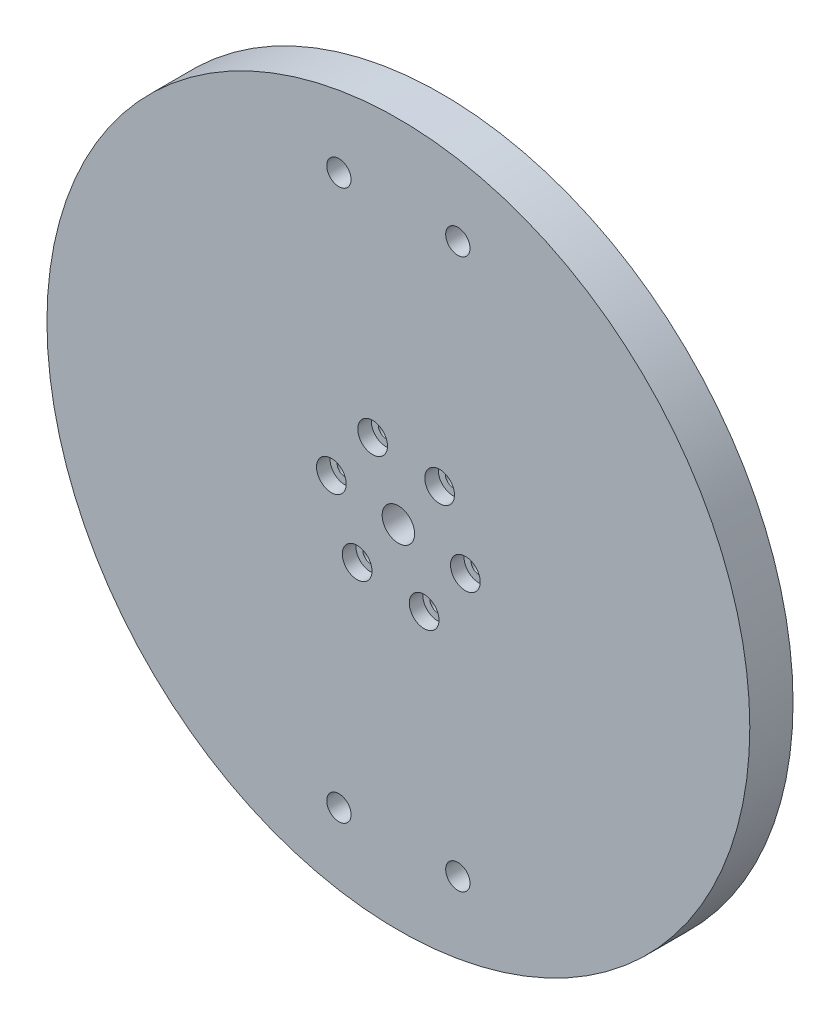
ISO-10303-21;
HEADER;
FILE_DESCRIPTION(('STEP AP214'),'2;1');
FILE_NAME('part.step','',(''),(''),'','','');
FILE_SCHEMA(('AUTOMOTIVE_DESIGN { 1 0 10303 214 1 1 1 1 }'));
ENDSEC;
DATA;
#1=APPLICATION_CONTEXT('core data for automotive mechanical design processes');
#2=APPLICATION_PROTOCOL_DEFINITION('international standard','automotive_design',2000,#1);
#3=PRODUCT_CONTEXT('',#1,'mechanical');
#4=PRODUCT('Part','Part','',(#3));
#5=PRODUCT_RELATED_PRODUCT_CATEGORY('part','',(#4));
#6=PRODUCT_DEFINITION_FORMATION('','',#4);
#7=PRODUCT_DEFINITION_CONTEXT('part definition',#1,'design');
#8=PRODUCT_DEFINITION('design','',#6,#7);
#9=PRODUCT_DEFINITION_SHAPE('','',#8);
#10=(LENGTH_UNIT() NAMED_UNIT(*) SI_UNIT(.MILLI.,.METRE.));
#11=(NAMED_UNIT(*) PLANE_ANGLE_UNIT() SI_UNIT($,.RADIAN.));
#12=(NAMED_UNIT(*) SI_UNIT($,.STERADIAN.) SOLID_ANGLE_UNIT());
#13=UNCERTAINTY_MEASURE_WITH_UNIT(LENGTH_MEASURE(1.E-05),#10,'distance_accuracy_value','');
#14=(GEOMETRIC_REPRESENTATION_CONTEXT(3) GLOBAL_UNCERTAINTY_ASSIGNED_CONTEXT((#13)) GLOBAL_UNIT_ASSIGNED_CONTEXT((#10,
#11,#12)) REPRESENTATION_CONTEXT('',''));
#15=CARTESIAN_POINT('',(0.,0.,0.));
#16=DIRECTION('',(0.,0.,1.));
#17=DIRECTION('',(1.,0.,0.));
#18=AXIS2_PLACEMENT_3D('',#15,#16,#17);
#19=CARTESIAN_POINT('',(7.62681454876585,9.90362054193988,78.));
#20=DIRECTION('',(0.,0.,-1.));
#21=DIRECTION('',(-1.,0.,0.));
#22=AXIS2_PLACEMENT_3D('',#19,#20,#21);
#23=CYLINDRICAL_SURFACE('',#22,1.45);
#24=CARTESIAN_POINT('',(7.62681454876585,9.90362054193988,70.));
#25=DIRECTION('',(0.,0.,1.));
#26=DIRECTION('',(1.,0.,0.));
#27=AXIS2_PLACEMENT_3D('',#24,#25,#26);
#28=CIRCLE('',#27,1.45);
#29=CARTESIAN_POINT('',(9.07681454876585,9.90362054193988,70.));
#30=VERTEX_POINT('',#29);
#31=EDGE_CURVE('E120',#30,#30,#28,.T.);
#32=ORIENTED_EDGE('',*,*,#31,.F.);
#33=EDGE_LOOP('',(#32));
#34=FACE_BOUND('',#33,.T.);
#35=CARTESIAN_POINT('',(7.62681454876585,9.90362054193988,75.5));
#36=DIRECTION('',(0.,0.,1.));
#37=DIRECTION('',(1.,0.,0.));
#38=AXIS2_PLACEMENT_3D('',#35,#36,#37);
#39=CIRCLE('',#38,1.45);
#40=CARTESIAN_POINT('',(9.07681454876585,9.90362054193988,75.5));
#41=VERTEX_POINT('',#40);
#42=EDGE_CURVE('E44',#41,#41,#39,.T.);
#43=ORIENTED_EDGE('',*,*,#42,.T.);
#44=EDGE_LOOP('',(#43));
#45=FACE_BOUND('',#44,.T.);
#46=ADVANCED_FACE('F41',(#34,#45),#23,.F.);
#47=CARTESIAN_POINT('',(-4.76337970437843,11.5568254201539,78.));
#48=DIRECTION('',(0.,0.,-1.));
#49=DIRECTION('',(-1.,0.,0.));
#50=AXIS2_PLACEMENT_3D('',#47,#48,#49);
#51=CYLINDRICAL_SURFACE('',#50,1.45);
#52=CARTESIAN_POINT('',(-4.76337970437843,11.5568254201539,70.));
#53=DIRECTION('',(0.,0.,1.));
#54=DIRECTION('',(1.,0.,0.));
#55=AXIS2_PLACEMENT_3D('',#52,#53,#54);
#56=CIRCLE('',#55,1.45);
#57=CARTESIAN_POINT('',(-3.31337970437843,11.5568254201539,70.));
#58=VERTEX_POINT('',#57);
#59=EDGE_CURVE('E121',#58,#58,#56,.T.);
#60=ORIENTED_EDGE('',*,*,#59,.F.);
#61=EDGE_LOOP('',(#60));
#62=FACE_BOUND('',#61,.T.);
#63=CARTESIAN_POINT('',(-4.76337970437843,11.5568254201539,75.5));
#64=DIRECTION('',(0.,0.,1.));
#65=DIRECTION('',(1.,0.,0.));
#66=AXIS2_PLACEMENT_3D('',#63,#64,#65);
#67=CIRCLE('',#66,1.45);
#68=CARTESIAN_POINT('',(-3.31337970437843,11.5568254201539,75.5));
#69=VERTEX_POINT('',#68);
#70=EDGE_CURVE('E96',#69,#69,#67,.T.);
#71=ORIENTED_EDGE('',*,*,#70,.T.);
#72=EDGE_LOOP('',(#71));
#73=FACE_BOUND('',#72,.T.);
#74=ADVANCED_FACE('F139',(#62,#73),#51,.F.);
#75=CARTESIAN_POINT('',(-12.3901942531443,1.65320487821403,78.));
#76=DIRECTION('',(0.,0.,-1.));
#77=DIRECTION('',(-1.,0.,0.));
#78=AXIS2_PLACEMENT_3D('',#75,#76,#77);
#79=CYLINDRICAL_SURFACE('',#78,1.45);
#80=CARTESIAN_POINT('',(-12.3901942531443,1.65320487821403,70.));
#81=DIRECTION('',(0.,0.,1.));
#82=DIRECTION('',(1.,0.,0.));
#83=AXIS2_PLACEMENT_3D('',#80,#81,#82);
#84=CIRCLE('',#83,1.45);
#85=CARTESIAN_POINT('',(-10.9401942531443,1.65320487821403,70.));
#86=VERTEX_POINT('',#85);
#87=EDGE_CURVE('E116',#86,#86,#84,.T.);
#88=ORIENTED_EDGE('',*,*,#87,.F.);
#89=EDGE_LOOP('',(#88));
#90=FACE_BOUND('',#89,.T.);
#91=CARTESIAN_POINT('',(-12.3901942531443,1.65320487821403,75.5));
#92=DIRECTION('',(0.,0.,1.));
#93=DIRECTION('',(1.,0.,0.));
#94=AXIS2_PLACEMENT_3D('',#91,#92,#93);
#95=CIRCLE('',#94,1.45);
#96=CARTESIAN_POINT('',(-10.9401942531443,1.65320487821403,75.5));
#97=VERTEX_POINT('',#96);
#98=EDGE_CURVE('E91',#97,#97,#95,.T.);
#99=ORIENTED_EDGE('',*,*,#98,.T.);
#100=EDGE_LOOP('',(#99));
#101=FACE_BOUND('',#100,.T.);
#102=ADVANCED_FACE('F133',(#90,#101),#79,.F.);
#103=CARTESIAN_POINT('',(-7.62681454876585,-9.90362054193988,78.));
#104=DIRECTION('',(0.,0.,-1.));
#105=DIRECTION('',(-1.,0.,0.));
#106=AXIS2_PLACEMENT_3D('',#103,#104,#105);
#107=CYLINDRICAL_SURFACE('',#106,1.45);
#108=CARTESIAN_POINT('',(-7.62681454876585,-9.90362054193988,70.));
#109=DIRECTION('',(0.,0.,1.));
#110=DIRECTION('',(1.,0.,0.));
#111=AXIS2_PLACEMENT_3D('',#108,#109,#110);
#112=CIRCLE('',#111,1.45);
#113=CARTESIAN_POINT('',(-6.17681454876585,-9.90362054193988,70.));
#114=VERTEX_POINT('',#113);
#115=EDGE_CURVE('E62',#114,#114,#112,.T.);
#116=ORIENTED_EDGE('',*,*,#115,.F.);
#117=EDGE_LOOP('',(#116));
#118=FACE_BOUND('',#117,.T.);
#119=CARTESIAN_POINT('',(-7.62681454876585,-9.90362054193988,75.5));
#120=DIRECTION('',(0.,0.,1.));
#121=DIRECTION('',(1.,0.,0.));
#122=AXIS2_PLACEMENT_3D('',#119,#120,#121);
#123=CIRCLE('',#122,1.45);
#124=CARTESIAN_POINT('',(-6.17681454876585,-9.90362054193988,75.5));
#125=VERTEX_POINT('',#124);
#126=EDGE_CURVE('E90',#125,#125,#123,.T.);
#127=ORIENTED_EDGE('',*,*,#126,.T.);
#128=EDGE_LOOP('',(#127));
#129=FACE_BOUND('',#128,.T.);
#130=ADVANCED_FACE('F140',(#118,#129),#107,.F.);
#131=CARTESIAN_POINT('',(4.76337970437842,-11.5568254201539,78.));
#132=DIRECTION('',(0.,0.,-1.));
#133=DIRECTION('',(-1.,0.,0.));
#134=AXIS2_PLACEMENT_3D('',#131,#132,#133);
#135=CYLINDRICAL_SURFACE('',#134,1.45);
#136=CARTESIAN_POINT('',(4.76337970437842,-11.5568254201539,70.));
#137=DIRECTION('',(0.,0.,1.));
#138=DIRECTION('',(1.,0.,0.));
#139=AXIS2_PLACEMENT_3D('',#136,#137,#138);
#140=CIRCLE('',#139,1.45);
#141=CARTESIAN_POINT('',(6.21337970437842,-11.5568254201539,70.));
#142=VERTEX_POINT('',#141);
#143=EDGE_CURVE('E104',#142,#142,#140,.T.);
#144=ORIENTED_EDGE('',*,*,#143,.F.);
#145=EDGE_LOOP('',(#144));
#146=FACE_BOUND('',#145,.T.);
#147=CARTESIAN_POINT('',(4.76337970437842,-11.5568254201539,75.5));
#148=DIRECTION('',(0.,0.,1.));
#149=DIRECTION('',(1.,0.,0.));
#150=AXIS2_PLACEMENT_3D('',#147,#148,#149);
#151=CIRCLE('',#150,1.45);
#152=CARTESIAN_POINT('',(6.21337970437842,-11.5568254201539,75.5));
#153=VERTEX_POINT('',#152);
#154=EDGE_CURVE('E81',#153,#153,#151,.T.);
#155=ORIENTED_EDGE('',*,*,#154,.T.);
#156=EDGE_LOOP('',(#155));
#157=FACE_BOUND('',#156,.T.);
#158=ADVANCED_FACE('F219',(#146,#157),#135,.F.);
#159=CARTESIAN_POINT('',(12.3901942531443,-1.65320487821403,78.));
#160=DIRECTION('',(0.,0.,-1.));
#161=DIRECTION('',(-1.,0.,0.));
#162=AXIS2_PLACEMENT_3D('',#159,#160,#161);
#163=CYLINDRICAL_SURFACE('',#162,1.45);
#164=CARTESIAN_POINT('',(12.3901942531443,-1.65320487821403,70.));
#165=DIRECTION('',(0.,0.,1.));
#166=DIRECTION('',(1.,0.,0.));
#167=AXIS2_PLACEMENT_3D('',#164,#165,#166);
#168=CIRCLE('',#167,1.45);
#169=CARTESIAN_POINT('',(13.8401942531443,-1.65320487821403,70.));
#170=VERTEX_POINT('',#169);
#171=EDGE_CURVE('E66',#170,#170,#168,.T.);
#172=ORIENTED_EDGE('',*,*,#171,.F.);
#173=EDGE_LOOP('',(#172));
#174=FACE_BOUND('',#173,.T.);
#175=CARTESIAN_POINT('',(12.3901942531443,-1.65320487821403,75.5));
#176=DIRECTION('',(0.,0.,1.));
#177=DIRECTION('',(1.,0.,0.));
#178=AXIS2_PLACEMENT_3D('',#175,#176,#177);
#179=CIRCLE('',#178,1.45);
#180=CARTESIAN_POINT('',(13.8401942531443,-1.65320487821403,75.5));
#181=VERTEX_POINT('',#180);
#182=EDGE_CURVE('E80',#181,#181,#179,.T.);
#183=ORIENTED_EDGE('',*,*,#182,.T.);
#184=EDGE_LOOP('',(#183));
#185=FACE_BOUND('',#184,.T.);
#186=ADVANCED_FACE('F285',(#174,#185),#163,.F.);
#187=CARTESIAN_POINT('',(0.,0.,78.));
#188=DIRECTION('',(0.,0.,-1.));
#189=DIRECTION('',(-1.,0.,0.));
#190=AXIS2_PLACEMENT_3D('',#187,#188,#189);
#191=CYLINDRICAL_SURFACE('',#190,65.);
#192=CARTESIAN_POINT('',(0.,0.,78.));
#193=DIRECTION('',(0.,0.,1.));
#194=DIRECTION('',(1.,0.,0.));
#195=AXIS2_PLACEMENT_3D('',#192,#193,#194);
#196=CIRCLE('',#195,65.);
#197=CARTESIAN_POINT('',(65.,0.,78.));
#198=VERTEX_POINT('',#197);
#199=EDGE_CURVE('E49',#198,#198,#196,.T.);
#200=ORIENTED_EDGE('',*,*,#199,.F.);
#201=EDGE_LOOP('',(#200));
#202=FACE_BOUND('',#201,.T.);
#203=CARTESIAN_POINT('',(0.,0.,70.));
#204=DIRECTION('',(0.,0.,1.));
#205=DIRECTION('',(1.,0.,0.));
#206=AXIS2_PLACEMENT_3D('',#203,#204,#205);
#207=CIRCLE('',#206,65.);
#208=CARTESIAN_POINT('',(65.,0.,70.));
#209=VERTEX_POINT('',#208);
#210=EDGE_CURVE('E59',#209,#209,#207,.T.);
#211=ORIENTED_EDGE('',*,*,#210,.T.);
#212=EDGE_LOOP('',(#211));
#213=FACE_BOUND('',#212,.T.);
#214=ADVANCED_FACE('F43',(#202,#213),#191,.T.);
#215=CARTESIAN_POINT('',(0.,0.,78.));
#216=DIRECTION('',(0.,0.,1.));
#217=DIRECTION('',(1.,0.,0.));
#218=AXIS2_PLACEMENT_3D('',#215,#216,#217);
#219=PLANE('',#218);
#220=CARTESIAN_POINT('',(-11.,50.86,78.));
#221=DIRECTION('',(0.,0.,1.));
#222=DIRECTION('',(1.,0.,0.));
#223=AXIS2_PLACEMENT_3D('',#220,#221,#222);
#224=CIRCLE('',#223,2.25);
#225=CARTESIAN_POINT('',(-8.75,50.86,78.));
#226=VERTEX_POINT('',#225);
#227=EDGE_CURVE('E309',#226,#226,#224,.T.);
#228=ORIENTED_EDGE('',*,*,#227,.F.);
#229=EDGE_LOOP('',(#228));
#230=FACE_BOUND('',#229,.T.);
#231=CARTESIAN_POINT('',(11.,-50.86,78.));
#232=DIRECTION('',(0.,0.,1.));
#233=DIRECTION('',(1.,0.,0.));
#234=AXIS2_PLACEMENT_3D('',#231,#232,#233);
#235=CIRCLE('',#234,2.25);
#236=CARTESIAN_POINT('',(13.25,-50.86,78.));
#237=VERTEX_POINT('',#236);
#238=EDGE_CURVE('E301',#237,#237,#235,.T.);
#239=ORIENTED_EDGE('',*,*,#238,.F.);
#240=EDGE_LOOP('',(#239));
#241=FACE_BOUND('',#240,.T.);
#242=CARTESIAN_POINT('',(11.,50.86,78.));
#243=DIRECTION('',(0.,0.,1.));
#244=DIRECTION('',(1.,0.,0.));
#245=AXIS2_PLACEMENT_3D('',#242,#243,#244);
#246=CIRCLE('',#245,2.25);
#247=CARTESIAN_POINT('',(13.25,50.86,78.));
#248=VERTEX_POINT('',#247);
#249=EDGE_CURVE('E297',#248,#248,#246,.T.);
#250=ORIENTED_EDGE('',*,*,#249,.F.);
#251=EDGE_LOOP('',(#250));
#252=FACE_BOUND('',#251,.T.);
#253=CARTESIAN_POINT('',(-11.,-50.86,78.));
#254=DIRECTION('',(0.,0.,1.));
#255=DIRECTION('',(1.,0.,0.));
#256=AXIS2_PLACEMENT_3D('',#253,#254,#255);
#257=CIRCLE('',#256,2.25);
#258=CARTESIAN_POINT('',(-8.75,-50.86,78.));
#259=VERTEX_POINT('',#258);
#260=EDGE_CURVE('E318',#259,#259,#257,.T.);
#261=ORIENTED_EDGE('',*,*,#260,.F.);
#262=EDGE_LOOP('',(#261));
#263=FACE_BOUND('',#262,.T.);
#264=CARTESIAN_POINT('',(0.,0.,78.));
#265=DIRECTION('',(0.,0.,1.));
#266=DIRECTION('',(1.,0.,0.));
#267=AXIS2_PLACEMENT_3D('',#264,#265,#266);
#268=CIRCLE('',#267,3.);
#269=CARTESIAN_POINT('',(3.,0.,78.));
#270=VERTEX_POINT('',#269);
#271=EDGE_CURVE('E324',#270,#270,#268,.T.);
#272=ORIENTED_EDGE('',*,*,#271,.F.);
#273=EDGE_LOOP('',(#272));
#274=FACE_BOUND('',#273,.T.);
#275=CARTESIAN_POINT('',(7.62681454876585,9.90362054193988,78.));
#276=DIRECTION('',(0.,0.,1.));
#277=DIRECTION('',(1.,0.,0.));
#278=AXIS2_PLACEMENT_3D('',#275,#276,#277);
#279=CIRCLE('',#278,2.75);
#280=CARTESIAN_POINT('',(10.3768145487658,9.90362054193988,78.));
#281=VERTEX_POINT('',#280);
#282=EDGE_CURVE('E183',#281,#281,#279,.T.);
#283=ORIENTED_EDGE('',*,*,#282,.F.);
#284=EDGE_LOOP('',(#283));
#285=FACE_BOUND('',#284,.T.);
#286=CARTESIAN_POINT('',(-4.76337970437843,11.5568254201539,78.));
#287=DIRECTION('',(0.,0.,1.));
#288=DIRECTION('',(1.,0.,0.));
#289=AXIS2_PLACEMENT_3D('',#286,#287,#288);
#290=CIRCLE('',#289,2.75);
#291=CARTESIAN_POINT('',(-2.01337970437843,11.5568254201539,78.));
#292=VERTEX_POINT('',#291);
#293=EDGE_CURVE('E153',#292,#292,#290,.T.);
#294=ORIENTED_EDGE('',*,*,#293,.F.);
#295=EDGE_LOOP('',(#294));
#296=FACE_BOUND('',#295,.T.);
#297=CARTESIAN_POINT('',(-12.3901942531443,1.65320487821403,78.));
#298=DIRECTION('',(0.,0.,1.));
#299=DIRECTION('',(1.,0.,0.));
#300=AXIS2_PLACEMENT_3D('',#297,#298,#299);
#301=CIRCLE('',#300,2.75);
#302=CARTESIAN_POINT('',(-9.64019425314427,1.65320487821403,78.));
#303=VERTEX_POINT('',#302);
#304=EDGE_CURVE('E152',#303,#303,#301,.T.);
#305=ORIENTED_EDGE('',*,*,#304,.F.);
#306=EDGE_LOOP('',(#305));
#307=FACE_BOUND('',#306,.T.);
#308=CARTESIAN_POINT('',(-7.62681454876585,-9.90362054193988,78.));
#309=DIRECTION('',(0.,0.,1.));
#310=DIRECTION('',(1.,0.,0.));
#311=AXIS2_PLACEMENT_3D('',#308,#309,#310);
#312=CIRCLE('',#311,2.75);
#313=CARTESIAN_POINT('',(-4.87681454876585,-9.90362054193988,78.));
#314=VERTEX_POINT('',#313);
#315=EDGE_CURVE('E166',#314,#314,#312,.T.);
#316=ORIENTED_EDGE('',*,*,#315,.F.);
#317=EDGE_LOOP('',(#316));
#318=FACE_BOUND('',#317,.T.);
#319=CARTESIAN_POINT('',(4.76337970437842,-11.5568254201539,78.));
#320=DIRECTION('',(0.,0.,1.));
#321=DIRECTION('',(1.,0.,0.));
#322=AXIS2_PLACEMENT_3D('',#319,#320,#321);
#323=CIRCLE('',#322,2.75);
#324=CARTESIAN_POINT('',(7.51337970437842,-11.5568254201539,78.));
#325=VERTEX_POINT('',#324);
#326=EDGE_CURVE('E191',#325,#325,#323,.T.);
#327=ORIENTED_EDGE('',*,*,#326,.F.);
#328=EDGE_LOOP('',(#327));
#329=FACE_BOUND('',#328,.T.);
#330=CARTESIAN_POINT('',(12.3901942531443,-1.65320487821403,78.));
#331=DIRECTION('',(0.,0.,1.));
#332=DIRECTION('',(1.,0.,0.));
#333=AXIS2_PLACEMENT_3D('',#330,#331,#332);
#334=CIRCLE('',#333,2.75);
#335=CARTESIAN_POINT('',(15.1401942531443,-1.65320487821403,78.));
#336=VERTEX_POINT('',#335);
#337=EDGE_CURVE('E83',#336,#336,#334,.T.);
#338=ORIENTED_EDGE('',*,*,#337,.F.);
#339=EDGE_LOOP('',(#338));
#340=FACE_BOUND('',#339,.T.);
#341=ORIENTED_EDGE('',*,*,#199,.T.);
#342=EDGE_LOOP('',(#341));
#343=FACE_BOUND('',#342,.T.);
#344=ADVANCED_FACE('F236',(#230,#241,#252,#263,#274,#285,#296,#307,#318,#329,#340,#343),#219,.T.);
#345=CARTESIAN_POINT('',(0.,0.,70.));
#346=DIRECTION('',(0.,0.,1.));
#347=DIRECTION('',(1.,0.,0.));
#348=AXIS2_PLACEMENT_3D('',#345,#346,#347);
#349=PLANE('',#348);
#350=CARTESIAN_POINT('',(-11.,50.86,70.));
#351=DIRECTION('',(0.,0.,1.));
#352=DIRECTION('',(1.,0.,0.));
#353=AXIS2_PLACEMENT_3D('',#350,#351,#352);
#354=CIRCLE('',#353,2.25);
#355=CARTESIAN_POINT('',(-8.75,50.86,70.));
#356=VERTEX_POINT('',#355);
#357=EDGE_CURVE('E307',#356,#356,#354,.T.);
#358=ORIENTED_EDGE('',*,*,#357,.T.);
#359=EDGE_LOOP('',(#358));
#360=FACE_BOUND('',#359,.T.);
#361=CARTESIAN_POINT('',(11.,-50.86,70.));
#362=DIRECTION('',(0.,0.,1.));
#363=DIRECTION('',(1.,0.,0.));
#364=AXIS2_PLACEMENT_3D('',#361,#362,#363);
#365=CIRCLE('',#364,2.25);
#366=CARTESIAN_POINT('',(13.25,-50.86,70.));
#367=VERTEX_POINT('',#366);
#368=EDGE_CURVE('E296',#367,#367,#365,.T.);
#369=ORIENTED_EDGE('',*,*,#368,.T.);
#370=EDGE_LOOP('',(#369));
#371=FACE_BOUND('',#370,.T.);
#372=CARTESIAN_POINT('',(11.,50.86,70.));
#373=DIRECTION('',(0.,0.,1.));
#374=DIRECTION('',(1.,0.,0.));
#375=AXIS2_PLACEMENT_3D('',#372,#373,#374);
#376=CIRCLE('',#375,2.25);
#377=CARTESIAN_POINT('',(13.25,50.86,70.));
#378=VERTEX_POINT('',#377);
#379=EDGE_CURVE('E298',#378,#378,#376,.T.);
#380=ORIENTED_EDGE('',*,*,#379,.T.);
#381=EDGE_LOOP('',(#380));
#382=FACE_BOUND('',#381,.T.);
#383=CARTESIAN_POINT('',(-11.,-50.86,70.));
#384=DIRECTION('',(0.,0.,1.));
#385=DIRECTION('',(1.,0.,0.));
#386=AXIS2_PLACEMENT_3D('',#383,#384,#385);
#387=CIRCLE('',#386,2.25);
#388=CARTESIAN_POINT('',(-8.75,-50.86,70.));
#389=VERTEX_POINT('',#388);
#390=EDGE_CURVE('E310',#389,#389,#387,.T.);
#391=ORIENTED_EDGE('',*,*,#390,.T.);
#392=EDGE_LOOP('',(#391));
#393=FACE_BOUND('',#392,.T.);
#394=CARTESIAN_POINT('',(0.,0.,70.));
#395=DIRECTION('',(0.,0.,1.));
#396=DIRECTION('',(1.,0.,0.));
#397=AXIS2_PLACEMENT_3D('',#394,#395,#396);
#398=CIRCLE('',#397,24.9);
#399=CARTESIAN_POINT('',(24.9,0.,70.));
#400=VERTEX_POINT('',#399);
#401=EDGE_CURVE('E68',#400,#400,#398,.T.);
#402=ORIENTED_EDGE('',*,*,#401,.T.);
#403=EDGE_LOOP('',(#402));
#404=FACE_BOUND('',#403,.T.);
#405=ORIENTED_EDGE('',*,*,#210,.F.);
#406=EDGE_LOOP('',(#405));
#407=FACE_BOUND('',#406,.T.);
#408=ADVANCED_FACE('F234',(#360,#371,#382,#393,#404,#407),#349,.F.);
#409=CARTESIAN_POINT('',(0.,0.,67.));
#410=DIRECTION('',(0.,0.,1.));
#411=DIRECTION('',(1.,0.,0.));
#412=AXIS2_PLACEMENT_3D('',#409,#410,#411);
#413=PLANE('',#412);
#414=CARTESIAN_POINT('',(0.,0.,67.));
#415=DIRECTION('',(0.,0.,1.));
#416=DIRECTION('',(1.,0.,0.));
#417=AXIS2_PLACEMENT_3D('',#414,#415,#416);
#418=CIRCLE('',#417,24.9);
#419=CARTESIAN_POINT('',(24.9,0.,67.));
#420=VERTEX_POINT('',#419);
#421=EDGE_CURVE('E69',#420,#420,#418,.T.);
#422=ORIENTED_EDGE('',*,*,#421,.F.);
#423=EDGE_LOOP('',(#422));
#424=FACE_BOUND('',#423,.T.);
#425=CARTESIAN_POINT('',(0.,0.,67.));
#426=DIRECTION('',(0.,0.,1.));
#427=DIRECTION('',(1.,0.,0.));
#428=AXIS2_PLACEMENT_3D('',#425,#426,#427);
#429=CIRCLE('',#428,23.);
#430=CARTESIAN_POINT('',(23.,0.,67.));
#431=VERTEX_POINT('',#430);
#432=EDGE_CURVE('E63',#431,#431,#429,.T.);
#433=ORIENTED_EDGE('',*,*,#432,.T.);
#434=EDGE_LOOP('',(#433));
#435=FACE_BOUND('',#434,.T.);
#436=ADVANCED_FACE('F230',(#424,#435),#413,.F.);
#437=CARTESIAN_POINT('',(0.,0.,70.));
#438=DIRECTION('',(0.,0.,-1.));
#439=DIRECTION('',(-1.,0.,0.));
#440=AXIS2_PLACEMENT_3D('',#437,#438,#439);
#441=CYLINDRICAL_SURFACE('',#440,24.9);
#442=ORIENTED_EDGE('',*,*,#401,.F.);
#443=EDGE_LOOP('',(#442));
#444=FACE_BOUND('',#443,.T.);
#445=ORIENTED_EDGE('',*,*,#421,.T.);
#446=EDGE_LOOP('',(#445));
#447=FACE_BOUND('',#446,.T.);
#448=ADVANCED_FACE('F228',(#444,#447),#441,.T.);
#449=CARTESIAN_POINT('',(0.,0.,70.));
#450=DIRECTION('',(0.,0.,-1.));
#451=DIRECTION('',(-1.,0.,0.));
#452=AXIS2_PLACEMENT_3D('',#449,#450,#451);
#453=CYLINDRICAL_SURFACE('',#452,23.);
#454=CARTESIAN_POINT('',(0.,0.,70.));
#455=DIRECTION('',(0.,0.,1.));
#456=DIRECTION('',(1.,0.,0.));
#457=AXIS2_PLACEMENT_3D('',#454,#455,#456);
#458=CIRCLE('',#457,23.);
#459=CARTESIAN_POINT('',(23.,0.,70.));
#460=VERTEX_POINT('',#459);
#461=EDGE_CURVE('E10',#460,#460,#458,.T.);
#462=ORIENTED_EDGE('',*,*,#461,.T.);
#463=EDGE_LOOP('',(#462));
#464=FACE_BOUND('',#463,.T.);
#465=ORIENTED_EDGE('',*,*,#432,.F.);
#466=EDGE_LOOP('',(#465));
#467=FACE_BOUND('',#466,.T.);
#468=ADVANCED_FACE('F226',(#464,#467),#453,.F.);
#469=CARTESIAN_POINT('',(0.,0.,70.));
#470=DIRECTION('',(0.,0.,1.));
#471=DIRECTION('',(1.,0.,0.));
#472=AXIS2_PLACEMENT_3D('',#469,#470,#471);
#473=CIRCLE('',#472,3.);
#474=CARTESIAN_POINT('',(3.,0.,70.));
#475=VERTEX_POINT('',#474);
#476=EDGE_CURVE('E260',#475,#475,#473,.T.);
#477=ORIENTED_EDGE('',*,*,#476,.T.);
#478=EDGE_LOOP('',(#477));
#479=FACE_BOUND('',#478,.T.);
#480=ORIENTED_EDGE('',*,*,#171,.T.);
#481=EDGE_LOOP('',(#480));
#482=FACE_BOUND('',#481,.T.);
#483=ORIENTED_EDGE('',*,*,#143,.T.);
#484=EDGE_LOOP('',(#483));
#485=FACE_BOUND('',#484,.T.);
#486=ORIENTED_EDGE('',*,*,#115,.T.);
#487=EDGE_LOOP('',(#486));
#488=FACE_BOUND('',#487,.T.);
#489=ORIENTED_EDGE('',*,*,#87,.T.);
#490=EDGE_LOOP('',(#489));
#491=FACE_BOUND('',#490,.T.);
#492=ORIENTED_EDGE('',*,*,#59,.T.);
#493=EDGE_LOOP('',(#492));
#494=FACE_BOUND('',#493,.T.);
#495=ORIENTED_EDGE('',*,*,#31,.T.);
#496=EDGE_LOOP('',(#495));
#497=FACE_BOUND('',#496,.T.);
#498=ORIENTED_EDGE('',*,*,#461,.F.);
#499=EDGE_LOOP('',(#498));
#500=FACE_BOUND('',#499,.T.);
#501=ADVANCED_FACE('F131',(#479,#482,#485,#488,#491,#494,#497,#500),#349,.F.);
#502=CARTESIAN_POINT('',(12.3901942531443,-1.65320487821403,78.));
#503=DIRECTION('',(0.,0.,-1.));
#504=DIRECTION('',(-1.,0.,0.));
#505=AXIS2_PLACEMENT_3D('',#502,#503,#504);
#506=CYLINDRICAL_SURFACE('',#505,2.75);
#507=ORIENTED_EDGE('',*,*,#337,.T.);
#508=EDGE_LOOP('',(#507));
#509=FACE_BOUND('',#508,.T.);
#510=CARTESIAN_POINT('',(12.3901942531443,-1.65320487821403,75.5));
#511=DIRECTION('',(0.,0.,1.));
#512=DIRECTION('',(1.,0.,0.));
#513=AXIS2_PLACEMENT_3D('',#510,#511,#512);
#514=CIRCLE('',#513,2.75);
#515=CARTESIAN_POINT('',(15.1401942531443,-1.65320487821403,75.5));
#516=VERTEX_POINT('',#515);
#517=EDGE_CURVE('E175',#516,#516,#514,.T.);
#518=ORIENTED_EDGE('',*,*,#517,.F.);
#519=EDGE_LOOP('',(#518));
#520=FACE_BOUND('',#519,.T.);
#521=ADVANCED_FACE('F250',(#509,#520),#506,.F.);
#522=CARTESIAN_POINT('',(12.3901942531443,-1.65320487821403,75.5));
#523=DIRECTION('',(0.,0.,1.));
#524=DIRECTION('',(1.,0.,0.));
#525=AXIS2_PLACEMENT_3D('',#522,#523,#524);
#526=PLANE('',#525);
#527=ORIENTED_EDGE('',*,*,#182,.F.);
#528=EDGE_LOOP('',(#527));
#529=FACE_BOUND('',#528,.T.);
#530=ORIENTED_EDGE('',*,*,#517,.T.);
#531=EDGE_LOOP('',(#530));
#532=FACE_BOUND('',#531,.T.);
#533=ADVANCED_FACE('F253',(#529,#532),#526,.T.);
#534=CARTESIAN_POINT('',(4.76337970437842,-11.5568254201539,78.));
#535=DIRECTION('',(0.,0.,-1.));
#536=DIRECTION('',(-1.,0.,0.));
#537=AXIS2_PLACEMENT_3D('',#534,#535,#536);
#538=CYLINDRICAL_SURFACE('',#537,2.75);
#539=ORIENTED_EDGE('',*,*,#326,.T.);
#540=EDGE_LOOP('',(#539));
#541=FACE_BOUND('',#540,.T.);
#542=CARTESIAN_POINT('',(4.76337970437842,-11.5568254201539,75.5));
#543=DIRECTION('',(0.,0.,1.));
#544=DIRECTION('',(1.,0.,0.));
#545=AXIS2_PLACEMENT_3D('',#542,#543,#544);
#546=CIRCLE('',#545,2.75);
#547=CARTESIAN_POINT('',(7.51337970437842,-11.5568254201539,75.5));
#548=VERTEX_POINT('',#547);
#549=EDGE_CURVE('E172',#548,#548,#546,.T.);
#550=ORIENTED_EDGE('',*,*,#549,.F.);
#551=EDGE_LOOP('',(#550));
#552=FACE_BOUND('',#551,.T.);
#553=ADVANCED_FACE('F279',(#541,#552),#538,.F.);
#554=CARTESIAN_POINT('',(4.76337970437842,-11.5568254201539,75.5));
#555=DIRECTION('',(0.,0.,1.));
#556=DIRECTION('',(1.,0.,0.));
#557=AXIS2_PLACEMENT_3D('',#554,#555,#556);
#558=PLANE('',#557);
#559=ORIENTED_EDGE('',*,*,#154,.F.);
#560=EDGE_LOOP('',(#559));
#561=FACE_BOUND('',#560,.T.);
#562=ORIENTED_EDGE('',*,*,#549,.T.);
#563=EDGE_LOOP('',(#562));
#564=FACE_BOUND('',#563,.T.);
#565=ADVANCED_FACE('F272',(#561,#564),#558,.T.);
#566=CARTESIAN_POINT('',(-7.62681454876585,-9.90362054193988,78.));
#567=DIRECTION('',(0.,0.,-1.));
#568=DIRECTION('',(-1.,0.,0.));
#569=AXIS2_PLACEMENT_3D('',#566,#567,#568);
#570=CYLINDRICAL_SURFACE('',#569,2.75);
#571=ORIENTED_EDGE('',*,*,#315,.T.);
#572=EDGE_LOOP('',(#571));
#573=FACE_BOUND('',#572,.T.);
#574=CARTESIAN_POINT('',(-7.62681454876585,-9.90362054193988,75.5));
#575=DIRECTION('',(0.,0.,1.));
#576=DIRECTION('',(1.,0.,0.));
#577=AXIS2_PLACEMENT_3D('',#574,#575,#576);
#578=CIRCLE('',#577,2.75);
#579=CARTESIAN_POINT('',(-4.87681454876585,-9.90362054193988,75.5));
#580=VERTEX_POINT('',#579);
#581=EDGE_CURVE('E165',#580,#580,#578,.T.);
#582=ORIENTED_EDGE('',*,*,#581,.F.);
#583=EDGE_LOOP('',(#582));
#584=FACE_BOUND('',#583,.T.);
#585=ADVANCED_FACE('F268',(#573,#584),#570,.F.);
#586=CARTESIAN_POINT('',(-7.62681454876585,-9.90362054193988,75.5));
#587=DIRECTION('',(0.,0.,1.));
#588=DIRECTION('',(1.,0.,0.));
#589=AXIS2_PLACEMENT_3D('',#586,#587,#588);
#590=PLANE('',#589);
#591=ORIENTED_EDGE('',*,*,#126,.F.);
#592=EDGE_LOOP('',(#591));
#593=FACE_BOUND('',#592,.T.);
#594=ORIENTED_EDGE('',*,*,#581,.T.);
#595=EDGE_LOOP('',(#594));
#596=FACE_BOUND('',#595,.T.);
#597=ADVANCED_FACE('F264',(#593,#596),#590,.T.);
#598=CARTESIAN_POINT('',(-12.3901942531443,1.65320487821403,78.));
#599=DIRECTION('',(0.,0.,-1.));
#600=DIRECTION('',(-1.,0.,0.));
#601=AXIS2_PLACEMENT_3D('',#598,#599,#600);
#602=CYLINDRICAL_SURFACE('',#601,2.75);
#603=ORIENTED_EDGE('',*,*,#304,.T.);
#604=EDGE_LOOP('',(#603));
#605=FACE_BOUND('',#604,.T.);
#606=CARTESIAN_POINT('',(-12.3901942531443,1.65320487821403,75.5));
#607=DIRECTION('',(0.,0.,1.));
#608=DIRECTION('',(1.,0.,0.));
#609=AXIS2_PLACEMENT_3D('',#606,#607,#608);
#610=CIRCLE('',#609,2.75);
#611=CARTESIAN_POINT('',(-9.64019425314427,1.65320487821403,75.5));
#612=VERTEX_POINT('',#611);
#613=EDGE_CURVE('E147',#612,#612,#610,.T.);
#614=ORIENTED_EDGE('',*,*,#613,.F.);
#615=EDGE_LOOP('',(#614));
#616=FACE_BOUND('',#615,.T.);
#617=ADVANCED_FACE('F148',(#605,#616),#602,.F.);
#618=CARTESIAN_POINT('',(-12.3901942531443,1.65320487821403,75.5));
#619=DIRECTION('',(0.,0.,1.));
#620=DIRECTION('',(1.,0.,0.));
#621=AXIS2_PLACEMENT_3D('',#618,#619,#620);
#622=PLANE('',#621);
#623=ORIENTED_EDGE('',*,*,#98,.F.);
#624=EDGE_LOOP('',(#623));
#625=FACE_BOUND('',#624,.T.);
#626=ORIENTED_EDGE('',*,*,#613,.T.);
#627=EDGE_LOOP('',(#626));
#628=FACE_BOUND('',#627,.T.);
#629=ADVANCED_FACE('F142',(#625,#628),#622,.T.);
#630=CARTESIAN_POINT('',(-4.76337970437843,11.5568254201539,78.));
#631=DIRECTION('',(0.,0.,-1.));
#632=DIRECTION('',(-1.,0.,0.));
#633=AXIS2_PLACEMENT_3D('',#630,#631,#632);
#634=CYLINDRICAL_SURFACE('',#633,2.75);
#635=ORIENTED_EDGE('',*,*,#293,.T.);
#636=EDGE_LOOP('',(#635));
#637=FACE_BOUND('',#636,.T.);
#638=CARTESIAN_POINT('',(-4.76337970437843,11.5568254201539,75.5));
#639=DIRECTION('',(0.,0.,1.));
#640=DIRECTION('',(1.,0.,0.));
#641=AXIS2_PLACEMENT_3D('',#638,#639,#640);
#642=CIRCLE('',#641,2.75);
#643=CARTESIAN_POINT('',(-2.01337970437843,11.5568254201539,75.5));
#644=VERTEX_POINT('',#643);
#645=EDGE_CURVE('E157',#644,#644,#642,.T.);
#646=ORIENTED_EDGE('',*,*,#645,.F.);
#647=EDGE_LOOP('',(#646));
#648=FACE_BOUND('',#647,.T.);
#649=ADVANCED_FACE('F144',(#637,#648),#634,.F.);
#650=CARTESIAN_POINT('',(-4.76337970437843,11.5568254201539,75.5));
#651=DIRECTION('',(0.,0.,1.));
#652=DIRECTION('',(1.,0.,0.));
#653=AXIS2_PLACEMENT_3D('',#650,#651,#652);
#654=PLANE('',#653);
#655=ORIENTED_EDGE('',*,*,#70,.F.);
#656=EDGE_LOOP('',(#655));
#657=FACE_BOUND('',#656,.T.);
#658=ORIENTED_EDGE('',*,*,#645,.T.);
#659=EDGE_LOOP('',(#658));
#660=FACE_BOUND('',#659,.T.);
#661=ADVANCED_FACE('F199',(#657,#660),#654,.T.);
#662=CARTESIAN_POINT('',(7.62681454876585,9.90362054193988,78.));
#663=DIRECTION('',(0.,0.,-1.));
#664=DIRECTION('',(-1.,0.,0.));
#665=AXIS2_PLACEMENT_3D('',#662,#663,#664);
#666=CYLINDRICAL_SURFACE('',#665,2.75);
#667=ORIENTED_EDGE('',*,*,#282,.T.);
#668=EDGE_LOOP('',(#667));
#669=FACE_BOUND('',#668,.T.);
#670=CARTESIAN_POINT('',(7.62681454876585,9.90362054193988,75.5));
#671=DIRECTION('',(0.,0.,1.));
#672=DIRECTION('',(1.,0.,0.));
#673=AXIS2_PLACEMENT_3D('',#670,#671,#672);
#674=CIRCLE('',#673,2.75);
#675=CARTESIAN_POINT('',(10.3768145487658,9.90362054193988,75.5));
#676=VERTEX_POINT('',#675);
#677=EDGE_CURVE('E179',#676,#676,#674,.T.);
#678=ORIENTED_EDGE('',*,*,#677,.F.);
#679=EDGE_LOOP('',(#678));
#680=FACE_BOUND('',#679,.T.);
#681=ADVANCED_FACE('F210',(#669,#680),#666,.F.);
#682=CARTESIAN_POINT('',(7.62681454876585,9.90362054193988,75.5));
#683=DIRECTION('',(0.,0.,1.));
#684=DIRECTION('',(1.,0.,0.));
#685=AXIS2_PLACEMENT_3D('',#682,#683,#684);
#686=PLANE('',#685);
#687=ORIENTED_EDGE('',*,*,#42,.F.);
#688=EDGE_LOOP('',(#687));
#689=FACE_BOUND('',#688,.T.);
#690=ORIENTED_EDGE('',*,*,#677,.T.);
#691=EDGE_LOOP('',(#690));
#692=FACE_BOUND('',#691,.T.);
#693=ADVANCED_FACE('F353',(#689,#692),#686,.T.);
#694=CARTESIAN_POINT('',(0.,0.,78.));
#695=DIRECTION('',(0.,0.,-1.));
#696=DIRECTION('',(-1.,0.,0.));
#697=AXIS2_PLACEMENT_3D('',#694,#695,#696);
#698=CYLINDRICAL_SURFACE('',#697,3.);
#699=ORIENTED_EDGE('',*,*,#271,.T.);
#700=EDGE_LOOP('',(#699));
#701=FACE_BOUND('',#700,.T.);
#702=ORIENTED_EDGE('',*,*,#476,.F.);
#703=EDGE_LOOP('',(#702));
#704=FACE_BOUND('',#703,.T.);
#705=ADVANCED_FACE('F348',(#701,#704),#698,.F.);
#706=CARTESIAN_POINT('',(-11.,-50.86,78.));
#707=DIRECTION('',(0.,0.,-1.));
#708=DIRECTION('',(-1.,0.,0.));
#709=AXIS2_PLACEMENT_3D('',#706,#707,#708);
#710=CYLINDRICAL_SURFACE('',#709,2.25);
#711=ORIENTED_EDGE('',*,*,#260,.T.);
#712=EDGE_LOOP('',(#711));
#713=FACE_BOUND('',#712,.T.);
#714=ORIENTED_EDGE('',*,*,#390,.F.);
#715=EDGE_LOOP('',(#714));
#716=FACE_BOUND('',#715,.T.);
#717=ADVANCED_FACE('F358',(#713,#716),#710,.F.);
#718=CARTESIAN_POINT('',(11.,50.86,78.));
#719=DIRECTION('',(0.,0.,-1.));
#720=DIRECTION('',(-1.,0.,0.));
#721=AXIS2_PLACEMENT_3D('',#718,#719,#720);
#722=CYLINDRICAL_SURFACE('',#721,2.25);
#723=ORIENTED_EDGE('',*,*,#249,.T.);
#724=EDGE_LOOP('',(#723));
#725=FACE_BOUND('',#724,.T.);
#726=ORIENTED_EDGE('',*,*,#379,.F.);
#727=EDGE_LOOP('',(#726));
#728=FACE_BOUND('',#727,.T.);
#729=ADVANCED_FACE('F365',(#725,#728),#722,.F.);
#730=CARTESIAN_POINT('',(11.,-50.86,78.));
#731=DIRECTION('',(0.,0.,-1.));
#732=DIRECTION('',(-1.,0.,0.));
#733=AXIS2_PLACEMENT_3D('',#730,#731,#732);
#734=CYLINDRICAL_SURFACE('',#733,2.25);
#735=ORIENTED_EDGE('',*,*,#238,.T.);
#736=EDGE_LOOP('',(#735));
#737=FACE_BOUND('',#736,.T.);
#738=ORIENTED_EDGE('',*,*,#368,.F.);
#739=EDGE_LOOP('',(#738));
#740=FACE_BOUND('',#739,.T.);
#741=ADVANCED_FACE('F441',(#737,#740),#734,.F.);
#742=CARTESIAN_POINT('',(-11.,50.86,78.));
#743=DIRECTION('',(0.,0.,-1.));
#744=DIRECTION('',(-1.,0.,0.));
#745=AXIS2_PLACEMENT_3D('',#742,#743,#744);
#746=CYLINDRICAL_SURFACE('',#745,2.25);
#747=ORIENTED_EDGE('',*,*,#227,.T.);
#748=EDGE_LOOP('',(#747));
#749=FACE_BOUND('',#748,.T.);
#750=ORIENTED_EDGE('',*,*,#357,.F.);
#751=EDGE_LOOP('',(#750));
#752=FACE_BOUND('',#751,.T.);
#753=ADVANCED_FACE('F454',(#749,#752),#746,.F.);
#754=CLOSED_SHELL('',(#46,#74,#102,#130,#158,#186,#214,#344,#408,#436,#448,#468,#501,#521,#533,
#553,#565,#585,#597,#617,#629,#649,#661,#681,#693,#705,#717,#729,#741,#753));
#755=MANIFOLD_SOLID_BREP('B2',#754);
#756=ADVANCED_BREP_SHAPE_REPRESENTATION('',(#18,#755),#14);
#757=SHAPE_DEFINITION_REPRESENTATION(#9,#756);
ENDSEC;
END-ISO-10303-21;
